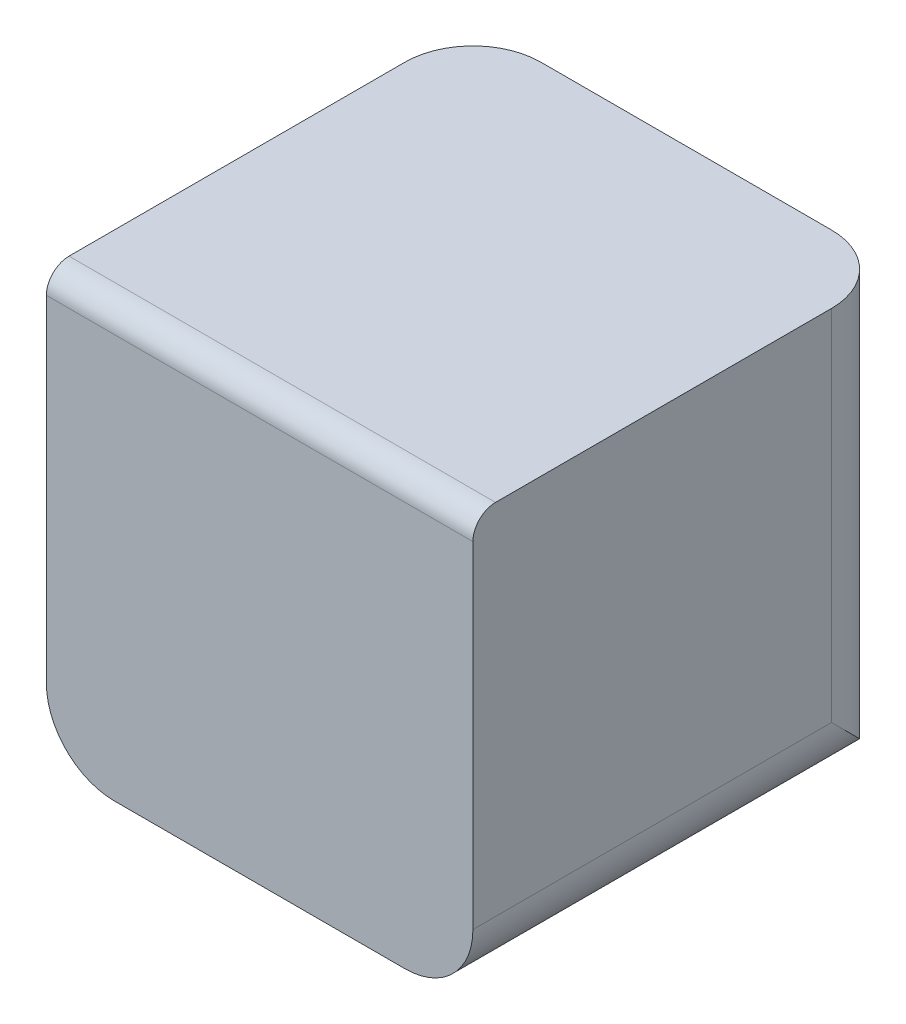
ISO-10303-21;
HEADER;
FILE_DESCRIPTION(('STEP AP214'),'2;1');
FILE_NAME('part.step','',(''),(''),'','','');
FILE_SCHEMA(('AUTOMOTIVE_DESIGN { 1 0 10303 214 1 1 1 1 }'));
ENDSEC;
DATA;
#1=APPLICATION_CONTEXT('core data for automotive mechanical design processes');
#2=APPLICATION_PROTOCOL_DEFINITION('international standard','automotive_design',2000,#1);
#3=PRODUCT_CONTEXT('',#1,'mechanical');
#4=PRODUCT('Part','Part','',(#3));
#5=PRODUCT_RELATED_PRODUCT_CATEGORY('part','',(#4));
#6=PRODUCT_DEFINITION_FORMATION('','',#4);
#7=PRODUCT_DEFINITION_CONTEXT('part definition',#1,'design');
#8=PRODUCT_DEFINITION('design','',#6,#7);
#9=PRODUCT_DEFINITION_SHAPE('','',#8);
#10=(LENGTH_UNIT() NAMED_UNIT(*) SI_UNIT(.MILLI.,.METRE.));
#11=(NAMED_UNIT(*) PLANE_ANGLE_UNIT() SI_UNIT($,.RADIAN.));
#12=(NAMED_UNIT(*) SI_UNIT($,.STERADIAN.) SOLID_ANGLE_UNIT());
#13=UNCERTAINTY_MEASURE_WITH_UNIT(LENGTH_MEASURE(1.E-05),#10,'distance_accuracy_value','');
#14=(GEOMETRIC_REPRESENTATION_CONTEXT(3) GLOBAL_UNCERTAINTY_ASSIGNED_CONTEXT((#13)) GLOBAL_UNIT_ASSIGNED_CONTEXT((#10,
#11,#12)) REPRESENTATION_CONTEXT('',''));
#15=CARTESIAN_POINT('',(0.,0.,0.));
#16=DIRECTION('',(0.,0.,1.));
#17=DIRECTION('',(1.,0.,0.));
#18=AXIS2_PLACEMENT_3D('',#15,#16,#17);
#19=CARTESIAN_POINT('',(9.42,18.84,9.42));
#20=DIRECTION('',(-1.,0.,0.));
#21=DIRECTION('',(0.,0.,1.));
#22=AXIS2_PLACEMENT_3D('',#19,#20,#21);
#23=PLANE('',#22);
#24=DIRECTION('',(0.,0.,-1.));
#25=VECTOR('',#24,1.);
#26=CARTESIAN_POINT('',(9.42,3.,-9.42));
#27=LINE('',#26,#25);
#28=CARTESIAN_POINT('',(9.42,3.,9.42));
#29=VERTEX_POINT('',#28);
#30=CARTESIAN_POINT('',(9.42,3.,-6.42));
#31=VERTEX_POINT('',#30);
#32=EDGE_CURVE('E150',#29,#31,#27,.T.);
#33=ORIENTED_EDGE('',*,*,#32,.T.);
#34=DIRECTION('',(0.,-1.,0.));
#35=VECTOR('',#34,1.);
#36=CARTESIAN_POINT('',(9.42,18.84,-6.42));
#37=LINE('',#36,#35);
#38=CARTESIAN_POINT('',(9.42,18.84,-6.42));
#39=VERTEX_POINT('',#38);
#40=EDGE_CURVE('E126',#31,#39,#37,.F.);
#41=ORIENTED_EDGE('',*,*,#40,.T.);
#42=DIRECTION('',(0.,0.,-1.));
#43=VECTOR('',#42,1.);
#44=CARTESIAN_POINT('',(9.42,18.84,9.42));
#45=LINE('',#44,#43);
#46=CARTESIAN_POINT('',(9.42,18.84,8.42));
#47=VERTEX_POINT('',#46);
#48=EDGE_CURVE('E118',#47,#39,#45,.T.);
#49=ORIENTED_EDGE('',*,*,#48,.F.);
#50=CARTESIAN_POINT('',(9.42,17.84,8.42));
#51=DIRECTION('',(-1.,0.,0.));
#52=DIRECTION('',(0.,0.,1.));
#53=AXIS2_PLACEMENT_3D('',#50,#51,#52);
#54=CIRCLE('',#53,1.);
#55=CARTESIAN_POINT('',(9.42,17.84,9.42));
#56=VERTEX_POINT('',#55);
#57=EDGE_CURVE('E104',#47,#56,#54,.F.);
#58=ORIENTED_EDGE('',*,*,#57,.T.);
#59=DIRECTION('',(0.,-1.,0.));
#60=VECTOR('',#59,1.);
#61=CARTESIAN_POINT('',(9.42,18.84,9.42));
#62=LINE('',#61,#60);
#63=EDGE_CURVE('E136',#56,#29,#62,.T.);
#64=ORIENTED_EDGE('',*,*,#63,.T.);
#65=EDGE_LOOP('',(#33,#41,#49,#58,#64));
#66=FACE_BOUND('',#65,.T.);
#67=ADVANCED_FACE('F37',(#66),#23,.F.);
#68=CARTESIAN_POINT('',(-9.42,18.84,-9.42));
#69=DIRECTION('',(0.,0.,1.));
#70=DIRECTION('',(1.,0.,0.));
#71=AXIS2_PLACEMENT_3D('',#68,#69,#70);
#72=PLANE('',#71);
#73=DIRECTION('',(-1.,0.,0.));
#74=VECTOR('',#73,1.);
#75=CARTESIAN_POINT('',(-9.42,18.84,-9.42));
#76=LINE('',#75,#74);
#77=CARTESIAN_POINT('',(6.42,18.84,-9.42));
#78=VERTEX_POINT('',#77);
#79=CARTESIAN_POINT('',(-6.42,18.84,-9.42));
#80=VERTEX_POINT('',#79);
#81=EDGE_CURVE('E127',#78,#80,#76,.T.);
#82=ORIENTED_EDGE('',*,*,#81,.F.);
#83=DIRECTION('',(0.,-1.,0.));
#84=VECTOR('',#83,1.);
#85=CARTESIAN_POINT('',(6.42,18.84,-9.42));
#86=LINE('',#85,#84);
#87=CARTESIAN_POINT('',(6.42,0.,-9.42));
#88=VERTEX_POINT('',#87);
#89=EDGE_CURVE('E147',#78,#88,#86,.T.);
#90=ORIENTED_EDGE('',*,*,#89,.T.);
#91=DIRECTION('',(-1.,0.,0.));
#92=VECTOR('',#91,1.);
#93=CARTESIAN_POINT('',(-9.42,0.,-9.42));
#94=LINE('',#93,#92);
#95=CARTESIAN_POINT('',(-6.42,0.,-9.42));
#96=VERTEX_POINT('',#95);
#97=EDGE_CURVE('E132',#88,#96,#94,.T.);
#98=ORIENTED_EDGE('',*,*,#97,.T.);
#99=DIRECTION('',(0.,-1.,0.));
#100=VECTOR('',#99,1.);
#101=CARTESIAN_POINT('',(-6.42,18.84,-9.42));
#102=LINE('',#101,#100);
#103=EDGE_CURVE('E145',#96,#80,#102,.F.);
#104=ORIENTED_EDGE('',*,*,#103,.T.);
#105=EDGE_LOOP('',(#82,#90,#98,#104));
#106=FACE_BOUND('',#105,.T.);
#107=ADVANCED_FACE('F187',(#106),#72,.F.);
#108=CARTESIAN_POINT('',(-9.42,18.84,9.42));
#109=DIRECTION('',(1.,0.,0.));
#110=DIRECTION('',(0.,0.,-1.));
#111=AXIS2_PLACEMENT_3D('',#108,#109,#110);
#112=PLANE('',#111);
#113=DIRECTION('',(0.,0.,1.));
#114=VECTOR('',#113,1.);
#115=CARTESIAN_POINT('',(-9.42,18.84,9.42));
#116=LINE('',#115,#114);
#117=CARTESIAN_POINT('',(-9.42,18.84,-6.42));
#118=VERTEX_POINT('',#117);
#119=CARTESIAN_POINT('',(-9.42,18.84,8.42));
#120=VERTEX_POINT('',#119);
#121=EDGE_CURVE('E121',#118,#120,#116,.T.);
#122=ORIENTED_EDGE('',*,*,#121,.F.);
#123=DIRECTION('',(0.,-1.,0.));
#124=VECTOR('',#123,1.);
#125=CARTESIAN_POINT('',(-9.42,18.84,-6.42));
#126=LINE('',#125,#124);
#127=CARTESIAN_POINT('',(-9.42,3.,-6.42));
#128=VERTEX_POINT('',#127);
#129=EDGE_CURVE('E159',#118,#128,#126,.T.);
#130=ORIENTED_EDGE('',*,*,#129,.T.);
#131=DIRECTION('',(0.,0.,1.));
#132=VECTOR('',#131,1.);
#133=CARTESIAN_POINT('',(-9.42,3.,9.42));
#134=LINE('',#133,#132);
#135=CARTESIAN_POINT('',(-9.42,3.,9.42));
#136=VERTEX_POINT('',#135);
#137=EDGE_CURVE('E157',#128,#136,#134,.T.);
#138=ORIENTED_EDGE('',*,*,#137,.T.);
#139=DIRECTION('',(0.,-1.,0.));
#140=VECTOR('',#139,1.);
#141=CARTESIAN_POINT('',(-9.42,18.84,9.42));
#142=LINE('',#141,#140);
#143=CARTESIAN_POINT('',(-9.42,17.84,9.42));
#144=VERTEX_POINT('',#143);
#145=EDGE_CURVE('E123',#144,#136,#142,.T.);
#146=ORIENTED_EDGE('',*,*,#145,.F.);
#147=CARTESIAN_POINT('',(-9.42,17.84,8.42));
#148=DIRECTION('',(1.,0.,0.));
#149=DIRECTION('',(0.,0.,-1.));
#150=AXIS2_PLACEMENT_3D('',#147,#148,#149);
#151=CIRCLE('',#150,1.);
#152=EDGE_CURVE('E143',#144,#120,#151,.F.);
#153=ORIENTED_EDGE('',*,*,#152,.T.);
#154=EDGE_LOOP('',(#122,#130,#138,#146,#153));
#155=FACE_BOUND('',#154,.T.);
#156=ADVANCED_FACE('F179',(#155),#112,.F.);
#157=CARTESIAN_POINT('',(-9.42,18.84,9.42));
#158=DIRECTION('',(0.,0.,-1.));
#159=DIRECTION('',(-1.,0.,0.));
#160=AXIS2_PLACEMENT_3D('',#157,#158,#159);
#161=PLANE('',#160);
#162=ORIENTED_EDGE('',*,*,#145,.T.);
#163=CARTESIAN_POINT('',(-6.42,3.,9.42));
#164=DIRECTION('',(0.,0.,-1.));
#165=DIRECTION('',(-1.,0.,0.));
#166=AXIS2_PLACEMENT_3D('',#163,#164,#165);
#167=CIRCLE('',#166,3.);
#168=CARTESIAN_POINT('',(-6.42,0.,9.42));
#169=VERTEX_POINT('',#168);
#170=EDGE_CURVE('E60',#136,#169,#167,.F.);
#171=ORIENTED_EDGE('',*,*,#170,.T.);
#172=DIRECTION('',(1.,0.,0.));
#173=VECTOR('',#172,1.);
#174=CARTESIAN_POINT('',(-9.42,0.,9.42));
#175=LINE('',#174,#173);
#176=CARTESIAN_POINT('',(6.42,0.,9.42));
#177=VERTEX_POINT('',#176);
#178=EDGE_CURVE('E128',#169,#177,#175,.T.);
#179=ORIENTED_EDGE('',*,*,#178,.T.);
#180=CARTESIAN_POINT('',(6.42,3.,9.42));
#181=DIRECTION('',(0.,0.,-1.));
#182=DIRECTION('',(-1.,0.,0.));
#183=AXIS2_PLACEMENT_3D('',#180,#181,#182);
#184=CIRCLE('',#183,3.);
#185=EDGE_CURVE('E162',#177,#29,#184,.F.);
#186=ORIENTED_EDGE('',*,*,#185,.T.);
#187=ORIENTED_EDGE('',*,*,#63,.F.);
#188=DIRECTION('',(1.,0.,0.));
#189=VECTOR('',#188,1.);
#190=CARTESIAN_POINT('',(-9.42,17.84,9.42));
#191=LINE('',#190,#189);
#192=EDGE_CURVE('E109',#56,#144,#191,.F.);
#193=ORIENTED_EDGE('',*,*,#192,.T.);
#194=EDGE_LOOP('',(#162,#171,#179,#186,#187,#193));
#195=FACE_BOUND('',#194,.T.);
#196=ADVANCED_FACE('F180',(#195),#161,.F.);
#197=CARTESIAN_POINT('',(0.,18.84,0.));
#198=DIRECTION('',(0.,-1.,0.));
#199=DIRECTION('',(0.,0.,-1.));
#200=AXIS2_PLACEMENT_3D('',#197,#198,#199);
#201=PLANE('',#200);
#202=ORIENTED_EDGE('',*,*,#48,.T.);
#203=CARTESIAN_POINT('',(6.42,18.84,-6.42));
#204=DIRECTION('',(0.,-1.,0.));
#205=DIRECTION('',(0.,0.,-1.));
#206=AXIS2_PLACEMENT_3D('',#203,#204,#205);
#207=CIRCLE('',#206,3.);
#208=EDGE_CURVE('E155',#39,#78,#207,.F.);
#209=ORIENTED_EDGE('',*,*,#208,.T.);
#210=ORIENTED_EDGE('',*,*,#81,.T.);
#211=CARTESIAN_POINT('',(-6.42,18.84,-6.42));
#212=DIRECTION('',(0.,-1.,0.));
#213=DIRECTION('',(0.,0.,-1.));
#214=AXIS2_PLACEMENT_3D('',#211,#212,#213);
#215=CIRCLE('',#214,3.);
#216=EDGE_CURVE('E153',#80,#118,#215,.F.);
#217=ORIENTED_EDGE('',*,*,#216,.T.);
#218=ORIENTED_EDGE('',*,*,#121,.T.);
#219=DIRECTION('',(1.,0.,0.));
#220=VECTOR('',#219,1.);
#221=CARTESIAN_POINT('',(0.,18.84,8.42));
#222=LINE('',#221,#220);
#223=EDGE_CURVE('E108',#120,#47,#222,.T.);
#224=ORIENTED_EDGE('',*,*,#223,.T.);
#225=EDGE_LOOP('',(#202,#209,#210,#217,#218,#224));
#226=FACE_BOUND('',#225,.T.);
#227=ADVANCED_FACE('F117',(#226),#201,.F.);
#228=CARTESIAN_POINT('',(0.,0.,0.));
#229=DIRECTION('',(0.,-1.,0.));
#230=DIRECTION('',(0.,0.,-1.));
#231=AXIS2_PLACEMENT_3D('',#228,#229,#230);
#232=PLANE('',#231);
#233=ORIENTED_EDGE('',*,*,#178,.F.);
#234=DIRECTION('',(0.,0.,1.));
#235=VECTOR('',#234,1.);
#236=CARTESIAN_POINT('',(-6.42,0.,-9.42));
#237=LINE('',#236,#235);
#238=EDGE_CURVE('E11',#169,#96,#237,.F.);
#239=ORIENTED_EDGE('',*,*,#238,.T.);
#240=ORIENTED_EDGE('',*,*,#97,.F.);
#241=DIRECTION('',(0.,0.,-1.));
#242=VECTOR('',#241,1.);
#243=CARTESIAN_POINT('',(6.42,0.,9.42));
#244=LINE('',#243,#242);
#245=EDGE_CURVE('E46',#88,#177,#244,.F.);
#246=ORIENTED_EDGE('',*,*,#245,.T.);
#247=EDGE_LOOP('',(#233,#239,#240,#246));
#248=FACE_BOUND('',#247,.T.);
#249=ADVANCED_FACE('F188',(#248),#232,.T.);
#250=CARTESIAN_POINT('',(0.,17.84,8.42));
#251=DIRECTION('',(1.,0.,0.));
#252=DIRECTION('',(0.,0.,-1.));
#253=AXIS2_PLACEMENT_3D('',#250,#251,#252);
#254=CYLINDRICAL_SURFACE('',#253,1.);
#255=ORIENTED_EDGE('',*,*,#152,.F.);
#256=ORIENTED_EDGE('',*,*,#192,.F.);
#257=ORIENTED_EDGE('',*,*,#57,.F.);
#258=ORIENTED_EDGE('',*,*,#223,.F.);
#259=EDGE_LOOP('',(#255,#256,#257,#258));
#260=FACE_BOUND('',#259,.T.);
#261=ADVANCED_FACE('F107',(#260),#254,.T.);
#262=CARTESIAN_POINT('',(6.42,3.,9.42));
#263=DIRECTION('',(0.,0.,1.));
#264=DIRECTION('',(1.,0.,0.));
#265=AXIS2_PLACEMENT_3D('',#262,#263,#264);
#266=CYLINDRICAL_SURFACE('',#265,3.);
#267=ORIENTED_EDGE('',*,*,#185,.F.);
#268=ORIENTED_EDGE('',*,*,#245,.F.);
#269=CARTESIAN_POINT('',(6.42,3.,-6.42));
#270=DIRECTION('',(0.,-0.707106781186547,0.707106781186547));
#271=DIRECTION('',(0.,0.707106781186547,0.707106781186547));
#272=AXIS2_PLACEMENT_3D('',#269,#270,#271);
#273=ELLIPSE('',#272,4.24264068711928,3.);
#274=EDGE_CURVE('E138',#31,#88,#273,.F.);
#275=ORIENTED_EDGE('',*,*,#274,.F.);
#276=ORIENTED_EDGE('',*,*,#32,.F.);
#277=EDGE_LOOP('',(#267,#268,#275,#276));
#278=FACE_BOUND('',#277,.T.);
#279=ADVANCED_FACE('F184',(#278),#266,.T.);
#280=CARTESIAN_POINT('',(6.42,18.84,-6.42));
#281=DIRECTION('',(0.,-1.,0.));
#282=DIRECTION('',(0.,0.,-1.));
#283=AXIS2_PLACEMENT_3D('',#280,#281,#282);
#284=CYLINDRICAL_SURFACE('',#283,3.);
#285=ORIENTED_EDGE('',*,*,#208,.F.);
#286=ORIENTED_EDGE('',*,*,#40,.F.);
#287=ORIENTED_EDGE('',*,*,#274,.T.);
#288=ORIENTED_EDGE('',*,*,#89,.F.);
#289=EDGE_LOOP('',(#285,#286,#287,#288));
#290=FACE_BOUND('',#289,.T.);
#291=ADVANCED_FACE('F206',(#290),#284,.T.);
#292=CARTESIAN_POINT('',(-6.42,3.,9.42));
#293=DIRECTION('',(0.,0.,-1.));
#294=DIRECTION('',(-1.,0.,0.));
#295=AXIS2_PLACEMENT_3D('',#292,#293,#294);
#296=CYLINDRICAL_SURFACE('',#295,3.);
#297=ORIENTED_EDGE('',*,*,#170,.F.);
#298=ORIENTED_EDGE('',*,*,#137,.F.);
#299=CARTESIAN_POINT('',(-6.42,3.,-6.42));
#300=DIRECTION('',(0.,0.707106781186547,-0.707106781186547));
#301=DIRECTION('',(0.,-0.707106781186547,-0.707106781186547));
#302=AXIS2_PLACEMENT_3D('',#299,#300,#301);
#303=ELLIPSE('',#302,4.24264068711928,3.);
#304=EDGE_CURVE('E41',#96,#128,#303,.T.);
#305=ORIENTED_EDGE('',*,*,#304,.F.);
#306=ORIENTED_EDGE('',*,*,#238,.F.);
#307=EDGE_LOOP('',(#297,#298,#305,#306));
#308=FACE_BOUND('',#307,.T.);
#309=ADVANCED_FACE('F39',(#308),#296,.T.);
#310=CARTESIAN_POINT('',(-6.42,18.84,-6.42));
#311=DIRECTION('',(0.,-1.,0.));
#312=DIRECTION('',(0.,0.,-1.));
#313=AXIS2_PLACEMENT_3D('',#310,#311,#312);
#314=CYLINDRICAL_SURFACE('',#313,3.);
#315=ORIENTED_EDGE('',*,*,#216,.F.);
#316=ORIENTED_EDGE('',*,*,#103,.F.);
#317=ORIENTED_EDGE('',*,*,#304,.T.);
#318=ORIENTED_EDGE('',*,*,#129,.F.);
#319=EDGE_LOOP('',(#315,#316,#317,#318));
#320=FACE_BOUND('',#319,.T.);
#321=ADVANCED_FACE('F174',(#320),#314,.T.);
#322=CLOSED_SHELL('',(#67,#107,#156,#196,#227,#249,#261,#279,#291,#309,#321));
#323=MANIFOLD_SOLID_BREP('B2',#322);
#324=ADVANCED_BREP_SHAPE_REPRESENTATION('',(#18,#323),#14);
#325=SHAPE_DEFINITION_REPRESENTATION(#9,#324);
ENDSEC;
END-ISO-10303-21;
